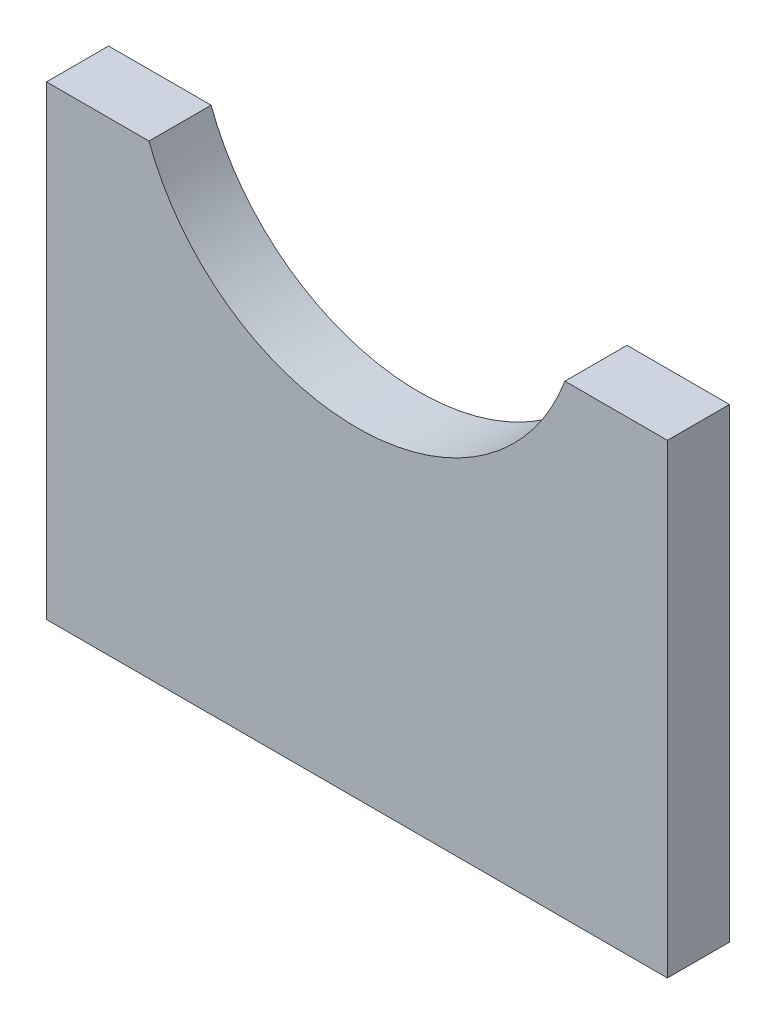
ISO-10303-21;
HEADER;
FILE_DESCRIPTION(('STEP AP214'),'2;1');
FILE_NAME('part.step','',(''),(''),'','','');
FILE_SCHEMA(('AUTOMOTIVE_DESIGN { 1 0 10303 214 1 1 1 1 }'));
ENDSEC;
DATA;
#1=APPLICATION_CONTEXT('core data for automotive mechanical design processes');
#2=APPLICATION_PROTOCOL_DEFINITION('international standard','automotive_design',2000,#1);
#3=PRODUCT_CONTEXT('',#1,'mechanical');
#4=PRODUCT('Part','Part','',(#3));
#5=PRODUCT_RELATED_PRODUCT_CATEGORY('part','',(#4));
#6=PRODUCT_DEFINITION_FORMATION('','',#4);
#7=PRODUCT_DEFINITION_CONTEXT('part definition',#1,'design');
#8=PRODUCT_DEFINITION('design','',#6,#7);
#9=PRODUCT_DEFINITION_SHAPE('','',#8);
#10=(LENGTH_UNIT() NAMED_UNIT(*) SI_UNIT(.MILLI.,.METRE.));
#11=(NAMED_UNIT(*) PLANE_ANGLE_UNIT() SI_UNIT($,.RADIAN.));
#12=(NAMED_UNIT(*) SI_UNIT($,.STERADIAN.) SOLID_ANGLE_UNIT());
#13=UNCERTAINTY_MEASURE_WITH_UNIT(LENGTH_MEASURE(1.E-05),#10,'distance_accuracy_value','');
#14=(GEOMETRIC_REPRESENTATION_CONTEXT(3) GLOBAL_UNCERTAINTY_ASSIGNED_CONTEXT((#13)) GLOBAL_UNIT_ASSIGNED_CONTEXT((#10,
#11,#12)) REPRESENTATION_CONTEXT('',''));
#15=CARTESIAN_POINT('',(0.,0.,0.));
#16=DIRECTION('',(0.,0.,1.));
#17=DIRECTION('',(1.,0.,0.));
#18=AXIS2_PLACEMENT_3D('',#15,#16,#17);
#19=CARTESIAN_POINT('',(-22.,30.,-43.7500000000476));
#20=DIRECTION('',(0.,-1.,0.));
#21=DIRECTION('',(0.,0.,-1.));
#22=AXIS2_PLACEMENT_3D('',#19,#20,#21);
#23=PLANE('',#22);
#24=DIRECTION('',(-1.,0.,0.));
#25=VECTOR('',#24,1.);
#26=CARTESIAN_POINT('',(-22.,30.,-47.7500000000476));
#27=LINE('',#26,#25);
#28=CARTESIAN_POINT('',(18.,30.,-47.7500000000476));
#29=VERTEX_POINT('',#28);
#30=CARTESIAN_POINT('',(11.3973878050919,30.,-47.7500000000476));
#31=VERTEX_POINT('',#30);
#32=EDGE_CURVE('E110',#29,#31,#27,.T.);
#33=ORIENTED_EDGE('',*,*,#32,.T.);
#34=DIRECTION('',(0.,0.,1.));
#35=VECTOR('',#34,1.);
#36=CARTESIAN_POINT('',(11.3973878050919,30.,-47.7510000000476));
#37=LINE('',#36,#35);
#38=CARTESIAN_POINT('',(11.3973878050919,30.,-43.7500000000476));
#39=VERTEX_POINT('',#38);
#40=EDGE_CURVE('E51',#39,#31,#37,.F.);
#41=ORIENTED_EDGE('',*,*,#40,.F.);
#42=DIRECTION('',(-1.,0.,0.));
#43=VECTOR('',#42,1.);
#44=CARTESIAN_POINT('',(-22.,30.,-43.7500000000476));
#45=LINE('',#44,#43);
#46=CARTESIAN_POINT('',(18.,30.,-43.7500000000476));
#47=VERTEX_POINT('',#46);
#48=EDGE_CURVE('E108',#47,#39,#45,.T.);
#49=ORIENTED_EDGE('',*,*,#48,.F.);
#50=DIRECTION('',(0.,0.,-1.));
#51=VECTOR('',#50,1.);
#52=CARTESIAN_POINT('',(18.,30.,-43.7500000000476));
#53=LINE('',#52,#51);
#54=EDGE_CURVE('E44',#47,#29,#53,.T.);
#55=ORIENTED_EDGE('',*,*,#54,.T.);
#56=EDGE_LOOP('',(#33,#41,#49,#55));
#57=FACE_BOUND('',#56,.T.);
#58=ADVANCED_FACE('F36',(#57),#23,.F.);
#59=CARTESIAN_POINT('',(-22.,0.,-43.7500000000476));
#60=DIRECTION('',(0.,1.,0.));
#61=DIRECTION('',(0.,0.,1.));
#62=AXIS2_PLACEMENT_3D('',#59,#60,#61);
#63=PLANE('',#62);
#64=DIRECTION('',(1.,0.,0.));
#65=VECTOR('',#64,1.);
#66=CARTESIAN_POINT('',(-22.,0.,-47.7500000000476));
#67=LINE('',#66,#65);
#68=CARTESIAN_POINT('',(-22.,0.,-47.7500000000476));
#69=VERTEX_POINT('',#68);
#70=CARTESIAN_POINT('',(18.,0.,-47.7500000000476));
#71=VERTEX_POINT('',#70);
#72=EDGE_CURVE('E120',#69,#71,#67,.T.);
#73=ORIENTED_EDGE('',*,*,#72,.T.);
#74=DIRECTION('',(0.,0.,-1.));
#75=VECTOR('',#74,1.);
#76=CARTESIAN_POINT('',(18.,0.,-43.7500000000476));
#77=LINE('',#76,#75);
#78=CARTESIAN_POINT('',(18.,0.,-43.7500000000476));
#79=VERTEX_POINT('',#78);
#80=EDGE_CURVE('E11',#79,#71,#77,.T.);
#81=ORIENTED_EDGE('',*,*,#80,.F.);
#82=DIRECTION('',(1.,0.,0.));
#83=VECTOR('',#82,1.);
#84=CARTESIAN_POINT('',(-22.,0.,-43.7500000000476));
#85=LINE('',#84,#83);
#86=CARTESIAN_POINT('',(-22.,0.,-43.7500000000476));
#87=VERTEX_POINT('',#86);
#88=EDGE_CURVE('E128',#87,#79,#85,.T.);
#89=ORIENTED_EDGE('',*,*,#88,.F.);
#90=DIRECTION('',(0.,0.,-1.));
#91=VECTOR('',#90,1.);
#92=CARTESIAN_POINT('',(-22.,0.,-43.7500000000476));
#93=LINE('',#92,#91);
#94=EDGE_CURVE('E115',#87,#69,#93,.T.);
#95=ORIENTED_EDGE('',*,*,#94,.T.);
#96=EDGE_LOOP('',(#73,#81,#89,#95));
#97=FACE_BOUND('',#96,.T.);
#98=ADVANCED_FACE('F38',(#97),#63,.F.);
#99=CARTESIAN_POINT('',(18.,0.,-43.7500000000476));
#100=DIRECTION('',(-1.,0.,0.));
#101=DIRECTION('',(0.,-1.,0.));
#102=AXIS2_PLACEMENT_3D('',#99,#100,#101);
#103=PLANE('',#102);
#104=DIRECTION('',(0.,1.,0.));
#105=VECTOR('',#104,1.);
#106=CARTESIAN_POINT('',(18.,0.,-47.7500000000476));
#107=LINE('',#106,#105);
#108=EDGE_CURVE('E123',#71,#29,#107,.T.);
#109=ORIENTED_EDGE('',*,*,#108,.T.);
#110=ORIENTED_EDGE('',*,*,#54,.F.);
#111=DIRECTION('',(0.,1.,0.));
#112=VECTOR('',#111,1.);
#113=CARTESIAN_POINT('',(18.,0.,-43.7500000000476));
#114=LINE('',#113,#112);
#115=EDGE_CURVE('E88',#79,#47,#114,.T.);
#116=ORIENTED_EDGE('',*,*,#115,.F.);
#117=ORIENTED_EDGE('',*,*,#80,.T.);
#118=EDGE_LOOP('',(#109,#110,#116,#117));
#119=FACE_BOUND('',#118,.T.);
#120=ADVANCED_FACE('F139',(#119),#103,.F.);
#121=CARTESIAN_POINT('',(-15.397387805092,30.,-43.7500000000476));
#122=VERTEX_POINT('',#121);
#123=CARTESIAN_POINT('',(-22.,30.,-43.7500000000476));
#124=VERTEX_POINT('',#123);
#125=EDGE_CURVE('E113',#122,#124,#45,.T.);
#126=ORIENTED_EDGE('',*,*,#125,.F.);
#127=DIRECTION('',(0.,0.,1.));
#128=VECTOR('',#127,1.);
#129=CARTESIAN_POINT('',(-15.397387805092,30.,-47.7510000000476));
#130=LINE('',#129,#128);
#131=CARTESIAN_POINT('',(-15.397387805092,30.,-47.7500000000476));
#132=VERTEX_POINT('',#131);
#133=EDGE_CURVE('E99',#132,#122,#130,.T.);
#134=ORIENTED_EDGE('',*,*,#133,.F.);
#135=CARTESIAN_POINT('',(-22.,30.,-47.7500000000476));
#136=VERTEX_POINT('',#135);
#137=EDGE_CURVE('E125',#132,#136,#27,.T.);
#138=ORIENTED_EDGE('',*,*,#137,.T.);
#139=DIRECTION('',(0.,0.,-1.));
#140=VECTOR('',#139,1.);
#141=CARTESIAN_POINT('',(-22.,30.,-43.7500000000476));
#142=LINE('',#141,#140);
#143=EDGE_CURVE('E130',#124,#136,#142,.T.);
#144=ORIENTED_EDGE('',*,*,#143,.F.);
#145=EDGE_LOOP('',(#126,#134,#138,#144));
#146=FACE_BOUND('',#145,.T.);
#147=ADVANCED_FACE('F141',(#146),#23,.F.);
#148=CARTESIAN_POINT('',(-22.,0.,-43.7500000000476));
#149=DIRECTION('',(1.,0.,0.));
#150=DIRECTION('',(0.,1.,0.));
#151=AXIS2_PLACEMENT_3D('',#148,#149,#150);
#152=PLANE('',#151);
#153=DIRECTION('',(0.,-1.,0.));
#154=VECTOR('',#153,1.);
#155=CARTESIAN_POINT('',(-22.,0.,-47.7500000000476));
#156=LINE('',#155,#154);
#157=EDGE_CURVE('E81',#136,#69,#156,.T.);
#158=ORIENTED_EDGE('',*,*,#157,.T.);
#159=ORIENTED_EDGE('',*,*,#94,.F.);
#160=DIRECTION('',(0.,-1.,0.));
#161=VECTOR('',#160,1.);
#162=CARTESIAN_POINT('',(-22.,0.,-43.7500000000476));
#163=LINE('',#162,#161);
#164=EDGE_CURVE('E60',#124,#87,#163,.T.);
#165=ORIENTED_EDGE('',*,*,#164,.F.);
#166=ORIENTED_EDGE('',*,*,#143,.T.);
#167=EDGE_LOOP('',(#158,#159,#165,#166));
#168=FACE_BOUND('',#167,.T.);
#169=ADVANCED_FACE('F146',(#168),#152,.F.);
#170=CARTESIAN_POINT('',(0.,0.,-43.7500000000476));
#171=DIRECTION('',(0.,0.,1.));
#172=DIRECTION('',(1.,0.,0.));
#173=AXIS2_PLACEMENT_3D('',#170,#171,#172);
#174=PLANE('',#173);
#175=CARTESIAN_POINT('',(-2.00000000000001,34.9999999999974,-43.7500000000476));
#176=DIRECTION('',(0.,0.,1.));
#177=DIRECTION('',(1.,0.,0.));
#178=AXIS2_PLACEMENT_3D('',#175,#176,#177);
#179=CIRCLE('',#178,14.3);
#180=EDGE_CURVE('E96',#122,#39,#179,.T.);
#181=ORIENTED_EDGE('',*,*,#180,.F.);
#182=ORIENTED_EDGE('',*,*,#125,.T.);
#183=ORIENTED_EDGE('',*,*,#164,.T.);
#184=ORIENTED_EDGE('',*,*,#88,.T.);
#185=ORIENTED_EDGE('',*,*,#115,.T.);
#186=ORIENTED_EDGE('',*,*,#48,.T.);
#187=EDGE_LOOP('',(#181,#182,#183,#184,#185,#186));
#188=FACE_BOUND('',#187,.T.);
#189=ADVANCED_FACE('F112',(#188),#174,.T.);
#190=CARTESIAN_POINT('',(0.,0.,-47.7500000000476));
#191=DIRECTION('',(0.,0.,1.));
#192=DIRECTION('',(1.,0.,0.));
#193=AXIS2_PLACEMENT_3D('',#190,#191,#192);
#194=PLANE('',#193);
#195=ORIENTED_EDGE('',*,*,#137,.F.);
#196=CARTESIAN_POINT('',(-2.00000000000001,34.9999999999974,-47.7500000000476));
#197=DIRECTION('',(0.,0.,1.));
#198=DIRECTION('',(1.,0.,0.));
#199=AXIS2_PLACEMENT_3D('',#196,#197,#198);
#200=CIRCLE('',#199,14.3);
#201=EDGE_CURVE('E102',#31,#132,#200,.F.);
#202=ORIENTED_EDGE('',*,*,#201,.F.);
#203=ORIENTED_EDGE('',*,*,#32,.F.);
#204=ORIENTED_EDGE('',*,*,#108,.F.);
#205=ORIENTED_EDGE('',*,*,#72,.F.);
#206=ORIENTED_EDGE('',*,*,#157,.F.);
#207=EDGE_LOOP('',(#195,#202,#203,#204,#205,#206));
#208=FACE_BOUND('',#207,.T.);
#209=ADVANCED_FACE('F133',(#208),#194,.F.);
#210=CARTESIAN_POINT('',(-2.00000000000001,34.9999999999974,-47.7510000000476));
#211=DIRECTION('',(0.,0.,1.));
#212=DIRECTION('',(1.,0.,0.));
#213=AXIS2_PLACEMENT_3D('',#210,#211,#212);
#214=CYLINDRICAL_SURFACE('',#213,14.3);
#215=ORIENTED_EDGE('',*,*,#40,.T.);
#216=ORIENTED_EDGE('',*,*,#201,.T.);
#217=ORIENTED_EDGE('',*,*,#133,.T.);
#218=ORIENTED_EDGE('',*,*,#180,.T.);
#219=EDGE_LOOP('',(#215,#216,#217,#218));
#220=FACE_BOUND('',#219,.T.);
#221=ADVANCED_FACE('F97',(#220),#214,.F.);
#222=CLOSED_SHELL('',(#58,#98,#120,#147,#169,#189,#209,#221));
#223=MANIFOLD_SOLID_BREP('B2',#222);
#224=ADVANCED_BREP_SHAPE_REPRESENTATION('',(#18,#223),#14);
#225=SHAPE_DEFINITION_REPRESENTATION(#9,#224);
ENDSEC;
END-ISO-10303-21;
